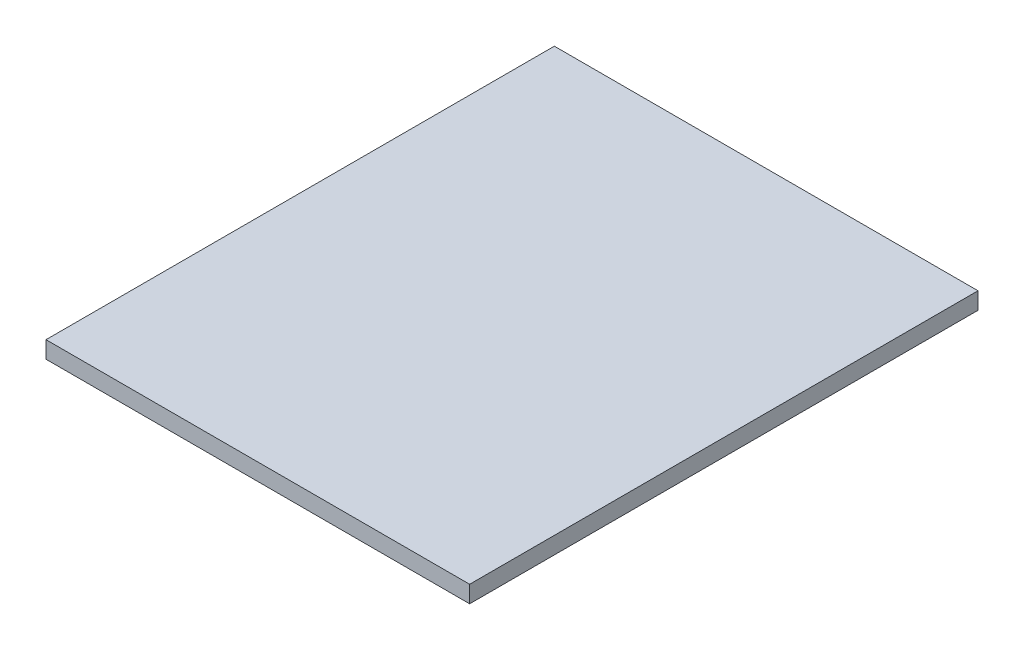
ISO-10303-21;
HEADER;
FILE_DESCRIPTION(('STEP AP214'),'2;1');
FILE_NAME('part.step','',(''),(''),'','','');
FILE_SCHEMA(('AUTOMOTIVE_DESIGN { 1 0 10303 214 1 1 1 1 }'));
ENDSEC;
DATA;
#1=APPLICATION_CONTEXT('core data for automotive mechanical design processes');
#2=APPLICATION_PROTOCOL_DEFINITION('international standard','automotive_design',2000,#1);
#3=PRODUCT_CONTEXT('',#1,'mechanical');
#4=PRODUCT('Part','Part','',(#3));
#5=PRODUCT_RELATED_PRODUCT_CATEGORY('part','',(#4));
#6=PRODUCT_DEFINITION_FORMATION('','',#4);
#7=PRODUCT_DEFINITION_CONTEXT('part definition',#1,'design');
#8=PRODUCT_DEFINITION('design','',#6,#7);
#9=PRODUCT_DEFINITION_SHAPE('','',#8);
#10=(LENGTH_UNIT() NAMED_UNIT(*) SI_UNIT(.MILLI.,.METRE.));
#11=(NAMED_UNIT(*) PLANE_ANGLE_UNIT() SI_UNIT($,.RADIAN.));
#12=(NAMED_UNIT(*) SI_UNIT($,.STERADIAN.) SOLID_ANGLE_UNIT());
#13=UNCERTAINTY_MEASURE_WITH_UNIT(LENGTH_MEASURE(1.E-05),#10,'distance_accuracy_value','');
#14=(GEOMETRIC_REPRESENTATION_CONTEXT(3) GLOBAL_UNCERTAINTY_ASSIGNED_CONTEXT((#13)) GLOBAL_UNIT_ASSIGNED_CONTEXT((#10,
#11,#12)) REPRESENTATION_CONTEXT('',''));
#15=CARTESIAN_POINT('',(0.,0.,0.));
#16=DIRECTION('',(0.,0.,1.));
#17=DIRECTION('',(1.,0.,0.));
#18=AXIS2_PLACEMENT_3D('',#15,#16,#17);
#19=CARTESIAN_POINT('',(125.,10.,-150.));
#20=DIRECTION('',(-1.,0.,0.));
#21=DIRECTION('',(0.,0.,1.));
#22=AXIS2_PLACEMENT_3D('',#19,#20,#21);
#23=PLANE('',#22);
#24=DIRECTION('',(0.,0.,-1.));
#25=VECTOR('',#24,1.);
#26=CARTESIAN_POINT('',(125.,0.,-150.));
#27=LINE('',#26,#25);
#28=CARTESIAN_POINT('',(125.,0.,150.));
#29=VERTEX_POINT('',#28);
#30=CARTESIAN_POINT('',(125.,0.,-150.));
#31=VERTEX_POINT('',#30);
#32=EDGE_CURVE('E113',#29,#31,#27,.T.);
#33=ORIENTED_EDGE('',*,*,#32,.T.);
#34=DIRECTION('',(0.,-1.,0.));
#35=VECTOR('',#34,1.);
#36=CARTESIAN_POINT('',(125.,10.,-150.));
#37=LINE('',#36,#35);
#38=CARTESIAN_POINT('',(125.,10.,-150.));
#39=VERTEX_POINT('',#38);
#40=EDGE_CURVE('E11',#39,#31,#37,.T.);
#41=ORIENTED_EDGE('',*,*,#40,.F.);
#42=DIRECTION('',(0.,0.,-1.));
#43=VECTOR('',#42,1.);
#44=CARTESIAN_POINT('',(125.,10.,-150.));
#45=LINE('',#44,#43);
#46=CARTESIAN_POINT('',(125.,10.,150.));
#47=VERTEX_POINT('',#46);
#48=EDGE_CURVE('E97',#47,#39,#45,.T.);
#49=ORIENTED_EDGE('',*,*,#48,.F.);
#50=DIRECTION('',(0.,-1.,0.));
#51=VECTOR('',#50,1.);
#52=CARTESIAN_POINT('',(125.,10.,150.));
#53=LINE('',#52,#51);
#54=EDGE_CURVE('E109',#47,#29,#53,.T.);
#55=ORIENTED_EDGE('',*,*,#54,.T.);
#56=EDGE_LOOP('',(#33,#41,#49,#55));
#57=FACE_BOUND('',#56,.T.);
#58=ADVANCED_FACE('F45',(#57),#23,.F.);
#59=CARTESIAN_POINT('',(-125.,10.,-150.));
#60=DIRECTION('',(0.,0.,1.));
#61=DIRECTION('',(1.,0.,0.));
#62=AXIS2_PLACEMENT_3D('',#59,#60,#61);
#63=PLANE('',#62);
#64=DIRECTION('',(-1.,0.,0.));
#65=VECTOR('',#64,1.);
#66=CARTESIAN_POINT('',(-125.,0.,-150.));
#67=LINE('',#66,#65);
#68=CARTESIAN_POINT('',(-125.,0.,-150.));
#69=VERTEX_POINT('',#68);
#70=EDGE_CURVE('E102',#31,#69,#67,.T.);
#71=ORIENTED_EDGE('',*,*,#70,.T.);
#72=DIRECTION('',(0.,-1.,0.));
#73=VECTOR('',#72,1.);
#74=CARTESIAN_POINT('',(-125.,10.,-150.));
#75=LINE('',#74,#73);
#76=CARTESIAN_POINT('',(-125.,10.,-150.));
#77=VERTEX_POINT('',#76);
#78=EDGE_CURVE('E54',#77,#69,#75,.T.);
#79=ORIENTED_EDGE('',*,*,#78,.F.);
#80=DIRECTION('',(-1.,0.,0.));
#81=VECTOR('',#80,1.);
#82=CARTESIAN_POINT('',(-125.,10.,-150.));
#83=LINE('',#82,#81);
#84=EDGE_CURVE('E92',#39,#77,#83,.T.);
#85=ORIENTED_EDGE('',*,*,#84,.F.);
#86=ORIENTED_EDGE('',*,*,#40,.T.);
#87=EDGE_LOOP('',(#71,#79,#85,#86));
#88=FACE_BOUND('',#87,.T.);
#89=ADVANCED_FACE('F101',(#88),#63,.F.);
#90=CARTESIAN_POINT('',(-125.,10.,-150.));
#91=DIRECTION('',(1.,0.,0.));
#92=DIRECTION('',(0.,0.,-1.));
#93=AXIS2_PLACEMENT_3D('',#90,#91,#92);
#94=PLANE('',#93);
#95=DIRECTION('',(0.,0.,1.));
#96=VECTOR('',#95,1.);
#97=CARTESIAN_POINT('',(-125.,0.,-150.));
#98=LINE('',#97,#96);
#99=CARTESIAN_POINT('',(-125.,0.,150.));
#100=VERTEX_POINT('',#99);
#101=EDGE_CURVE('E79',#69,#100,#98,.T.);
#102=ORIENTED_EDGE('',*,*,#101,.T.);
#103=DIRECTION('',(0.,-1.,0.));
#104=VECTOR('',#103,1.);
#105=CARTESIAN_POINT('',(-125.,10.,150.));
#106=LINE('',#105,#104);
#107=CARTESIAN_POINT('',(-125.,10.,150.));
#108=VERTEX_POINT('',#107);
#109=EDGE_CURVE('E104',#108,#100,#106,.T.);
#110=ORIENTED_EDGE('',*,*,#109,.F.);
#111=DIRECTION('',(0.,0.,1.));
#112=VECTOR('',#111,1.);
#113=CARTESIAN_POINT('',(-125.,10.,-150.));
#114=LINE('',#113,#112);
#115=EDGE_CURVE('E95',#77,#108,#114,.T.);
#116=ORIENTED_EDGE('',*,*,#115,.F.);
#117=ORIENTED_EDGE('',*,*,#78,.T.);
#118=EDGE_LOOP('',(#102,#110,#116,#117));
#119=FACE_BOUND('',#118,.T.);
#120=ADVANCED_FACE('F105',(#119),#94,.F.);
#121=CARTESIAN_POINT('',(-125.,10.,150.));
#122=DIRECTION('',(0.,0.,-1.));
#123=DIRECTION('',(-1.,0.,0.));
#124=AXIS2_PLACEMENT_3D('',#121,#122,#123);
#125=PLANE('',#124);
#126=DIRECTION('',(1.,0.,0.));
#127=VECTOR('',#126,1.);
#128=CARTESIAN_POINT('',(-125.,0.,150.));
#129=LINE('',#128,#127);
#130=EDGE_CURVE('E85',#100,#29,#129,.T.);
#131=ORIENTED_EDGE('',*,*,#130,.T.);
#132=ORIENTED_EDGE('',*,*,#54,.F.);
#133=DIRECTION('',(1.,0.,0.));
#134=VECTOR('',#133,1.);
#135=CARTESIAN_POINT('',(-125.,10.,150.));
#136=LINE('',#135,#134);
#137=EDGE_CURVE('E62',#108,#47,#136,.T.);
#138=ORIENTED_EDGE('',*,*,#137,.F.);
#139=ORIENTED_EDGE('',*,*,#109,.T.);
#140=EDGE_LOOP('',(#131,#132,#138,#139));
#141=FACE_BOUND('',#140,.T.);
#142=ADVANCED_FACE('F126',(#141),#125,.F.);
#143=CARTESIAN_POINT('',(0.,10.,0.));
#144=DIRECTION('',(0.,1.,0.));
#145=DIRECTION('',(0.,0.,1.));
#146=AXIS2_PLACEMENT_3D('',#143,#144,#145);
#147=PLANE('',#146);
#148=ORIENTED_EDGE('',*,*,#48,.T.);
#149=ORIENTED_EDGE('',*,*,#84,.T.);
#150=ORIENTED_EDGE('',*,*,#115,.T.);
#151=ORIENTED_EDGE('',*,*,#137,.T.);
#152=EDGE_LOOP('',(#148,#149,#150,#151));
#153=FACE_BOUND('',#152,.T.);
#154=ADVANCED_FACE('F93',(#153),#147,.T.);
#155=CARTESIAN_POINT('',(0.,0.,0.));
#156=DIRECTION('',(0.,1.,0.));
#157=DIRECTION('',(0.,0.,1.));
#158=AXIS2_PLACEMENT_3D('',#155,#156,#157);
#159=PLANE('',#158);
#160=ORIENTED_EDGE('',*,*,#32,.F.);
#161=ORIENTED_EDGE('',*,*,#130,.F.);
#162=ORIENTED_EDGE('',*,*,#101,.F.);
#163=ORIENTED_EDGE('',*,*,#70,.F.);
#164=EDGE_LOOP('',(#160,#161,#162,#163));
#165=FACE_BOUND('',#164,.T.);
#166=ADVANCED_FACE('F129',(#165),#159,.F.);
#167=CLOSED_SHELL('',(#58,#89,#120,#142,#154,#166));
#168=MANIFOLD_SOLID_BREP('B2',#167);
#169=ADVANCED_BREP_SHAPE_REPRESENTATION('',(#18,#168),#14);
#170=SHAPE_DEFINITION_REPRESENTATION(#9,#169);
ENDSEC;
END-ISO-10303-21;
